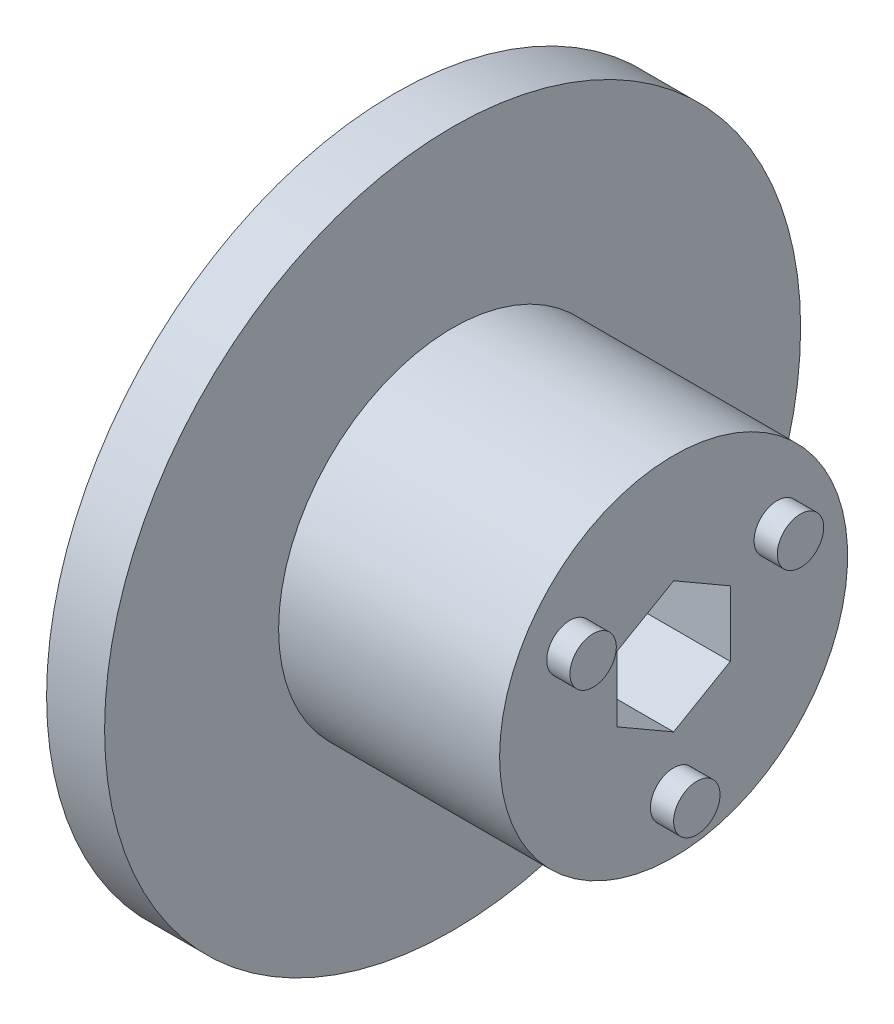
ISO-10303-21;
HEADER;
FILE_DESCRIPTION(('STEP AP214'),'2;1');
FILE_NAME('part.step','',(''),(''),'','','');
FILE_SCHEMA(('AUTOMOTIVE_DESIGN { 1 0 10303 214 1 1 1 1 }'));
ENDSEC;
DATA;
#1=APPLICATION_CONTEXT('core data for automotive mechanical design processes');
#2=APPLICATION_PROTOCOL_DEFINITION('international standard','automotive_design',2000,#1);
#3=PRODUCT_CONTEXT('',#1,'mechanical');
#4=PRODUCT('Part','Part','',(#3));
#5=PRODUCT_RELATED_PRODUCT_CATEGORY('part','',(#4));
#6=PRODUCT_DEFINITION_FORMATION('','',#4);
#7=PRODUCT_DEFINITION_CONTEXT('part definition',#1,'design');
#8=PRODUCT_DEFINITION('design','',#6,#7);
#9=PRODUCT_DEFINITION_SHAPE('','',#8);
#10=(LENGTH_UNIT() NAMED_UNIT(*) SI_UNIT(.MILLI.,.METRE.));
#11=(NAMED_UNIT(*) PLANE_ANGLE_UNIT() SI_UNIT($,.RADIAN.));
#12=(NAMED_UNIT(*) SI_UNIT($,.STERADIAN.) SOLID_ANGLE_UNIT());
#13=UNCERTAINTY_MEASURE_WITH_UNIT(LENGTH_MEASURE(1.E-05),#10,'distance_accuracy_value','');
#14=(GEOMETRIC_REPRESENTATION_CONTEXT(3) GLOBAL_UNCERTAINTY_ASSIGNED_CONTEXT((#13)) GLOBAL_UNIT_ASSIGNED_CONTEXT((#10,
#11,#12)) REPRESENTATION_CONTEXT('',''));
#15=CARTESIAN_POINT('',(0.,0.,0.));
#16=DIRECTION('',(0.,0.,1.));
#17=DIRECTION('',(1.,0.,0.));
#18=AXIS2_PLACEMENT_3D('',#15,#16,#17);
#19=CARTESIAN_POINT('',(5.,0.,0.));
#20=DIRECTION('',(-1.,0.,0.));
#21=DIRECTION('',(0.,0.,1.));
#22=AXIS2_PLACEMENT_3D('',#19,#20,#21);
#23=CYLINDRICAL_SURFACE('',#22,30.);
#24=CARTESIAN_POINT('',(5.,0.,0.));
#25=DIRECTION('',(1.,0.,0.));
#26=DIRECTION('',(0.,0.,-1.));
#27=AXIS2_PLACEMENT_3D('',#24,#25,#26);
#28=CIRCLE('',#27,30.);
#29=CARTESIAN_POINT('',(5.,0.,-30.));
#30=VERTEX_POINT('',#29);
#31=EDGE_CURVE('E48',#30,#30,#28,.T.);
#32=ORIENTED_EDGE('',*,*,#31,.F.);
#33=EDGE_LOOP('',(#32));
#34=FACE_BOUND('',#33,.T.);
#35=CARTESIAN_POINT('',(0.,0.,0.));
#36=DIRECTION('',(1.,0.,0.));
#37=DIRECTION('',(0.,0.,-1.));
#38=AXIS2_PLACEMENT_3D('',#35,#36,#37);
#39=CIRCLE('',#38,30.);
#40=CARTESIAN_POINT('',(0.,0.,-30.));
#41=VERTEX_POINT('',#40);
#42=EDGE_CURVE('E42',#41,#41,#39,.T.);
#43=ORIENTED_EDGE('',*,*,#42,.T.);
#44=EDGE_LOOP('',(#43));
#45=FACE_BOUND('',#44,.T.);
#46=ADVANCED_FACE('F39',(#34,#45),#23,.T.);
#47=CARTESIAN_POINT('',(5.,0.,0.));
#48=DIRECTION('',(1.,0.,0.));
#49=DIRECTION('',(0.,0.,-1.));
#50=AXIS2_PLACEMENT_3D('',#47,#48,#49);
#51=PLANE('',#50);
#52=CARTESIAN_POINT('',(5.,0.,0.));
#53=DIRECTION('',(1.,0.,0.));
#54=DIRECTION('',(0.,0.,-1.));
#55=AXIS2_PLACEMENT_3D('',#52,#53,#54);
#56=CIRCLE('',#55,15.);
#57=CARTESIAN_POINT('',(5.,0.,15.));
#58=VERTEX_POINT('',#57);
#59=EDGE_CURVE('E11',#58,#58,#56,.T.);
#60=ORIENTED_EDGE('',*,*,#59,.F.);
#61=EDGE_LOOP('',(#60));
#62=FACE_BOUND('',#61,.T.);
#63=ORIENTED_EDGE('',*,*,#31,.T.);
#64=EDGE_LOOP('',(#63));
#65=FACE_BOUND('',#64,.T.);
#66=ADVANCED_FACE('F163',(#62,#65),#51,.T.);
#67=CARTESIAN_POINT('',(0.,0.,0.));
#68=DIRECTION('',(1.,0.,0.));
#69=DIRECTION('',(0.,0.,-1.));
#70=AXIS2_PLACEMENT_3D('',#67,#68,#69);
#71=PLANE('',#70);
#72=DIRECTION('',(0.,-1.,0.));
#73=VECTOR('',#72,1.);
#74=CARTESIAN_POINT('',(0.,-2.82035606499132,-4.885));
#75=LINE('',#74,#73);
#76=CARTESIAN_POINT('',(0.,2.82035606499132,-4.885));
#77=VERTEX_POINT('',#76);
#78=CARTESIAN_POINT('',(0.,-2.82035606499132,-4.885));
#79=VERTEX_POINT('',#78);
#80=EDGE_CURVE('E354',#77,#79,#75,.T.);
#81=ORIENTED_EDGE('',*,*,#80,.F.);
#82=DIRECTION('',(0.,-0.5,-0.866025403784439));
#83=VECTOR('',#82,1.);
#84=CARTESIAN_POINT('',(0.,2.82035606499132,-4.885));
#85=LINE('',#84,#83);
#86=CARTESIAN_POINT('',(0.,5.64071212998265,0.));
#87=VERTEX_POINT('',#86);
#88=EDGE_CURVE('E148',#87,#77,#85,.T.);
#89=ORIENTED_EDGE('',*,*,#88,.F.);
#90=DIRECTION('',(0.,0.5,-0.866025403784439));
#91=VECTOR('',#90,1.);
#92=CARTESIAN_POINT('',(0.,5.64071212998265,0.));
#93=LINE('',#92,#91);
#94=CARTESIAN_POINT('',(0.,2.82035606499132,4.885));
#95=VERTEX_POINT('',#94);
#96=EDGE_CURVE('E144',#95,#87,#93,.T.);
#97=ORIENTED_EDGE('',*,*,#96,.F.);
#98=DIRECTION('',(0.,1.,0.));
#99=VECTOR('',#98,1.);
#100=CARTESIAN_POINT('',(0.,2.82035606499132,4.885));
#101=LINE('',#100,#99);
#102=CARTESIAN_POINT('',(0.,-2.82035606499132,4.885));
#103=VERTEX_POINT('',#102);
#104=EDGE_CURVE('E100',#103,#95,#101,.T.);
#105=ORIENTED_EDGE('',*,*,#104,.F.);
#106=DIRECTION('',(0.,0.5,0.866025403784439));
#107=VECTOR('',#106,1.);
#108=CARTESIAN_POINT('',(0.,-2.82035606499132,4.885));
#109=LINE('',#108,#107);
#110=CARTESIAN_POINT('',(0.,-5.64071212998265,0.));
#111=VERTEX_POINT('',#110);
#112=EDGE_CURVE('E348',#111,#103,#109,.T.);
#113=ORIENTED_EDGE('',*,*,#112,.F.);
#114=DIRECTION('',(0.,-0.5,0.866025403784439));
#115=VECTOR('',#114,1.);
#116=CARTESIAN_POINT('',(0.,-5.64071212998265,0.));
#117=LINE('',#116,#115);
#118=EDGE_CURVE('E351',#79,#111,#117,.T.);
#119=ORIENTED_EDGE('',*,*,#118,.F.);
#120=EDGE_LOOP('',(#81,#89,#97,#105,#113,#119));
#121=FACE_BOUND('',#120,.T.);
#122=ORIENTED_EDGE('',*,*,#42,.F.);
#123=EDGE_LOOP('',(#122));
#124=FACE_BOUND('',#123,.T.);
#125=ADVANCED_FACE('F160',(#121,#124),#71,.F.);
#126=CARTESIAN_POINT('',(24.05,0.,0.));
#127=DIRECTION('',(-1.,0.,0.));
#128=DIRECTION('',(0.,0.,1.));
#129=AXIS2_PLACEMENT_3D('',#126,#127,#128);
#130=CYLINDRICAL_SURFACE('',#129,15.);
#131=CARTESIAN_POINT('',(24.05,0.,0.));
#132=DIRECTION('',(1.,0.,0.));
#133=DIRECTION('',(0.,0.,-1.));
#134=AXIS2_PLACEMENT_3D('',#131,#132,#133);
#135=CIRCLE('',#134,15.);
#136=CARTESIAN_POINT('',(24.05,0.,15.));
#137=VERTEX_POINT('',#136);
#138=EDGE_CURVE('E147',#137,#137,#135,.T.);
#139=CARTESIAN_POINT('',(24.05,0.,15.));
#140=CARTESIAN_POINT('',(23.8515625,0.,15.));
#141=CARTESIAN_POINT('',(23.653125,0.,15.));
#142=CARTESIAN_POINT('',(23.25625,0.,15.));
#143=CARTESIAN_POINT('',(23.0578125,0.,15.));
#144=CARTESIAN_POINT('',(22.6609375,0.,15.));
#145=CARTESIAN_POINT('',(22.4625,0.,15.));
#146=CARTESIAN_POINT('',(22.065625,0.,15.));
#147=CARTESIAN_POINT('',(21.8671875,0.,15.));
#148=CARTESIAN_POINT('',(21.4703125,0.,15.));
#149=CARTESIAN_POINT('',(21.271875,0.,15.));
#150=CARTESIAN_POINT('',(20.875,0.,15.));
#151=CARTESIAN_POINT('',(20.6765625,0.,15.));
#152=CARTESIAN_POINT('',(20.2796875,0.,15.));
#153=CARTESIAN_POINT('',(20.08125,0.,15.));
#154=CARTESIAN_POINT('',(19.684375,0.,15.));
#155=CARTESIAN_POINT('',(19.4859375,0.,15.));
#156=CARTESIAN_POINT('',(19.0890625,0.,15.));
#157=CARTESIAN_POINT('',(18.890625,0.,15.));
#158=CARTESIAN_POINT('',(18.49375,0.,15.));
#159=CARTESIAN_POINT('',(18.2953125,0.,15.));
#160=CARTESIAN_POINT('',(17.8984375,0.,15.));
#161=CARTESIAN_POINT('',(17.7,0.,15.));
#162=CARTESIAN_POINT('',(17.303125,0.,15.));
#163=CARTESIAN_POINT('',(17.1046875,0.,15.));
#164=CARTESIAN_POINT('',(16.7078125,0.,15.));
#165=CARTESIAN_POINT('',(16.509375,0.,15.));
#166=CARTESIAN_POINT('',(16.1125,0.,15.));
#167=CARTESIAN_POINT('',(15.9140625,0.,15.));
#168=CARTESIAN_POINT('',(15.5171875,0.,15.));
#169=CARTESIAN_POINT('',(15.31875,0.,15.));
#170=CARTESIAN_POINT('',(14.921875,0.,15.));
#171=CARTESIAN_POINT('',(14.7234375,0.,15.));
#172=CARTESIAN_POINT('',(14.3265625,0.,15.));
#173=CARTESIAN_POINT('',(14.128125,0.,15.));
#174=CARTESIAN_POINT('',(13.73125,0.,15.));
#175=CARTESIAN_POINT('',(13.5328125,0.,15.));
#176=CARTESIAN_POINT('',(13.1359375,0.,15.));
#177=CARTESIAN_POINT('',(12.9375,0.,15.));
#178=CARTESIAN_POINT('',(12.540625,0.,15.));
#179=CARTESIAN_POINT('',(12.3421875,0.,15.));
#180=CARTESIAN_POINT('',(11.9453125,0.,15.));
#181=CARTESIAN_POINT('',(11.746875,0.,15.));
#182=CARTESIAN_POINT('',(11.35,0.,15.));
#183=CARTESIAN_POINT('',(11.1515625,0.,15.));
#184=CARTESIAN_POINT('',(10.7546875,0.,15.));
#185=CARTESIAN_POINT('',(10.55625,0.,15.));
#186=CARTESIAN_POINT('',(10.159375,0.,15.));
#187=CARTESIAN_POINT('',(9.9609375,0.,15.));
#188=CARTESIAN_POINT('',(9.5640625,0.,15.));
#189=CARTESIAN_POINT('',(9.365625,0.,15.));
#190=CARTESIAN_POINT('',(8.96875,0.,15.));
#191=CARTESIAN_POINT('',(8.7703125,0.,15.));
#192=CARTESIAN_POINT('',(8.3734375,0.,15.));
#193=CARTESIAN_POINT('',(8.175,0.,15.));
#194=CARTESIAN_POINT('',(7.778125,0.,15.));
#195=CARTESIAN_POINT('',(7.5796875,0.,15.));
#196=CARTESIAN_POINT('',(7.1828125,0.,15.));
#197=CARTESIAN_POINT('',(6.984375,0.,15.));
#198=CARTESIAN_POINT('',(6.5875,0.,15.));
#199=CARTESIAN_POINT('',(6.3890625,0.,15.));
#200=CARTESIAN_POINT('',(5.9921875,0.,15.));
#201=CARTESIAN_POINT('',(5.79375,0.,15.));
#202=CARTESIAN_POINT('',(5.396875,0.,15.));
#203=CARTESIAN_POINT('',(5.1984375,0.,15.));
#204=CARTESIAN_POINT('',(5.,0.,15.));
#205=B_SPLINE_CURVE_WITH_KNOTS('',3,(#139,#140,#141,#142,#143,#144,#145,#146,#147,#148,#149,
#150,#151,#152,#153,#154,#155,#156,#157,#158,#159,#160,#161,#162,#163,#164,#165,#166,#167,#168,
#169,#170,#171,#172,#173,#174,#175,#176,#177,#178,#179,#180,#181,#182,#183,#184,#185,#186,#187,
#188,#189,#190,#191,#192,#193,#194,#195,#196,#197,#198,#199,#200,#201,#202,#203,#204),
.UNSPECIFIED.,.F.,.F.,(4,2,2,2,2,2,2,2,2,2,2,2,2,2,2,2,2,2,2,2,2,2,2,2,2,2,2,2,2,2,2,2,4),(0.,
0.5953125,1.190625,1.7859375,2.38125,2.9765625,3.571875,4.1671875,4.7625,5.3578125,5.953125,
6.5484375,7.14375,7.7390625,8.334375,8.9296875,9.525,10.1203125,10.715625,11.3109375,11.90625,
12.5015625,13.096875,13.6921875,14.2875,14.8828125,15.478125,16.0734375,16.66875,17.2640625,
17.859375,18.4546875,19.05),.UNSPECIFIED.);
#206=EDGE_CURVE('BSEAM162',#137,#58,#205,.T.);
#207=ORIENTED_EDGE('',*,*,#138,.F.);
#208=ORIENTED_EDGE('',*,*,#59,.T.);
#209=ORIENTED_EDGE('',*,*,#206,.T.);
#210=ORIENTED_EDGE('',*,*,#206,.F.);
#211=EDGE_LOOP('',(#207,#209,#208,#210));
#212=FACE_BOUND('',#211,.T.);
#213=ADVANCED_FACE('F162',(#212),#130,.T.);
#214=CARTESIAN_POINT('',(24.05,0.,0.));
#215=DIRECTION('',(1.,0.,0.));
#216=DIRECTION('',(0.,0.,-1.));
#217=AXIS2_PLACEMENT_3D('',#214,#215,#216);
#218=PLANE('',#217);
#219=CARTESIAN_POINT('',(24.05,5.16017803249566,8.93769052838329));
#220=DIRECTION('',(1.,0.,0.));
#221=DIRECTION('',(0.,0.,-1.));
#222=AXIS2_PLACEMENT_3D('',#219,#220,#221);
#223=CIRCLE('',#222,2.);
#224=CARTESIAN_POINT('',(24.05,5.16017803249566,6.93769052838329));
#225=VERTEX_POINT('',#224);
#226=EDGE_CURVE('E325',#225,#225,#223,.T.);
#227=ORIENTED_EDGE('',*,*,#226,.F.);
#228=EDGE_LOOP('',(#227));
#229=FACE_BOUND('',#228,.T.);
#230=CARTESIAN_POINT('',(24.05,5.16017803249567,-8.93769052838329));
#231=DIRECTION('',(1.,0.,0.));
#232=DIRECTION('',(0.,0.,-1.));
#233=AXIS2_PLACEMENT_3D('',#230,#231,#232);
#234=CIRCLE('',#233,2.);
#235=CARTESIAN_POINT('',(24.05,5.16017803249567,-10.9376905283833));
#236=VERTEX_POINT('',#235);
#237=EDGE_CURVE('E324',#236,#236,#234,.T.);
#238=ORIENTED_EDGE('',*,*,#237,.F.);
#239=EDGE_LOOP('',(#238));
#240=FACE_BOUND('',#239,.T.);
#241=CARTESIAN_POINT('',(24.05,-10.3203560649913,0.));
#242=DIRECTION('',(1.,0.,0.));
#243=DIRECTION('',(0.,0.,-1.));
#244=AXIS2_PLACEMENT_3D('',#241,#242,#243);
#245=CIRCLE('',#244,2.);
#246=CARTESIAN_POINT('',(24.05,-10.3203560649913,-2.));
#247=VERTEX_POINT('',#246);
#248=EDGE_CURVE('E337',#247,#247,#245,.T.);
#249=ORIENTED_EDGE('',*,*,#248,.F.);
#250=EDGE_LOOP('',(#249));
#251=FACE_BOUND('',#250,.T.);
#252=DIRECTION('',(0.,0.5,0.866025403784439));
#253=VECTOR('',#252,1.);
#254=CARTESIAN_POINT('',(24.05,2.82035606499132,-4.885));
#255=LINE('',#254,#253);
#256=CARTESIAN_POINT('',(24.05,2.82035606499132,-4.885));
#257=VERTEX_POINT('',#256);
#258=CARTESIAN_POINT('',(24.05,5.64071212998265,0.));
#259=VERTEX_POINT('',#258);
#260=EDGE_CURVE('E64',#257,#259,#255,.T.);
#261=ORIENTED_EDGE('',*,*,#260,.F.);
#262=DIRECTION('',(0.,1.,0.));
#263=VECTOR('',#262,1.);
#264=CARTESIAN_POINT('',(24.05,-2.82035606499132,-4.885));
#265=LINE('',#264,#263);
#266=CARTESIAN_POINT('',(24.05,-2.82035606499132,-4.885));
#267=VERTEX_POINT('',#266);
#268=EDGE_CURVE('E127',#267,#257,#265,.T.);
#269=ORIENTED_EDGE('',*,*,#268,.F.);
#270=DIRECTION('',(0.,0.5,-0.866025403784439));
#271=VECTOR('',#270,1.);
#272=CARTESIAN_POINT('',(24.05,-5.64071212998265,0.));
#273=LINE('',#272,#271);
#274=CARTESIAN_POINT('',(24.05,-5.64071212998265,0.));
#275=VERTEX_POINT('',#274);
#276=EDGE_CURVE('E120',#275,#267,#273,.T.);
#277=ORIENTED_EDGE('',*,*,#276,.F.);
#278=DIRECTION('',(0.,-0.5,-0.866025403784439));
#279=VECTOR('',#278,1.);
#280=CARTESIAN_POINT('',(24.05,-2.82035606499132,4.885));
#281=LINE('',#280,#279);
#282=CARTESIAN_POINT('',(24.05,-2.82035606499132,4.885));
#283=VERTEX_POINT('',#282);
#284=EDGE_CURVE('E116',#283,#275,#281,.T.);
#285=ORIENTED_EDGE('',*,*,#284,.F.);
#286=DIRECTION('',(0.,-1.,0.));
#287=VECTOR('',#286,1.);
#288=CARTESIAN_POINT('',(24.05,2.82035606499132,4.885));
#289=LINE('',#288,#287);
#290=CARTESIAN_POINT('',(24.05,2.82035606499132,4.885));
#291=VERTEX_POINT('',#290);
#292=EDGE_CURVE('E97',#291,#283,#289,.T.);
#293=ORIENTED_EDGE('',*,*,#292,.F.);
#294=DIRECTION('',(0.,-0.5,0.866025403784439));
#295=VECTOR('',#294,1.);
#296=CARTESIAN_POINT('',(24.05,5.64071212998265,0.));
#297=LINE('',#296,#295);
#298=EDGE_CURVE('E107',#259,#291,#297,.T.);
#299=ORIENTED_EDGE('',*,*,#298,.F.);
#300=EDGE_LOOP('',(#261,#269,#277,#285,#293,#299));
#301=FACE_BOUND('',#300,.T.);
#302=ORIENTED_EDGE('',*,*,#138,.T.);
#303=EDGE_LOOP('',(#302));
#304=FACE_BOUND('',#303,.T.);
#305=ADVANCED_FACE('F112',(#229,#240,#251,#301,#304),#218,.T.);
#306=CARTESIAN_POINT('',(-14.9239215132395,2.82035606499132,-4.885));
#307=DIRECTION('',(0.,0.866025403784439,-0.5));
#308=DIRECTION('',(0.,0.5,0.866025403784439));
#309=AXIS2_PLACEMENT_3D('',#306,#307,#308);
#310=PLANE('',#309);
#311=ORIENTED_EDGE('',*,*,#88,.T.);
#312=DIRECTION('',(1.,0.,0.));
#313=VECTOR('',#312,1.);
#314=CARTESIAN_POINT('',(-14.9239215132395,2.82035606499132,-4.885));
#315=LINE('',#314,#313);
#316=EDGE_CURVE('E131',#77,#257,#315,.T.);
#317=ORIENTED_EDGE('',*,*,#316,.T.);
#318=ORIENTED_EDGE('',*,*,#260,.T.);
#319=DIRECTION('',(1.,0.,0.));
#320=VECTOR('',#319,1.);
#321=CARTESIAN_POINT('',(-14.9239215132395,5.64071212998265,0.));
#322=LINE('',#321,#320);
#323=EDGE_CURVE('E104',#87,#259,#322,.T.);
#324=ORIENTED_EDGE('',*,*,#323,.F.);
#325=EDGE_LOOP('',(#311,#317,#318,#324));
#326=FACE_BOUND('',#325,.T.);
#327=ADVANCED_FACE('F199',(#326),#310,.F.);
#328=CARTESIAN_POINT('',(-14.9239215132395,-2.82035606499132,-4.885));
#329=DIRECTION('',(0.,0.,-1.));
#330=DIRECTION('',(-1.,0.,0.));
#331=AXIS2_PLACEMENT_3D('',#328,#329,#330);
#332=PLANE('',#331);
#333=ORIENTED_EDGE('',*,*,#80,.T.);
#334=DIRECTION('',(1.,0.,0.));
#335=VECTOR('',#334,1.);
#336=CARTESIAN_POINT('',(-14.9239215132395,-2.82035606499132,-4.885));
#337=LINE('',#336,#335);
#338=EDGE_CURVE('E134',#79,#267,#337,.T.);
#339=ORIENTED_EDGE('',*,*,#338,.T.);
#340=ORIENTED_EDGE('',*,*,#268,.T.);
#341=ORIENTED_EDGE('',*,*,#316,.F.);
#342=EDGE_LOOP('',(#333,#339,#340,#341));
#343=FACE_BOUND('',#342,.T.);
#344=ADVANCED_FACE('F204',(#343),#332,.F.);
#345=CARTESIAN_POINT('',(-14.9239215132395,-5.64071212998265,0.));
#346=DIRECTION('',(0.,-0.866025403784438,-0.5));
#347=DIRECTION('',(0.,0.5,-0.866025403784439));
#348=AXIS2_PLACEMENT_3D('',#345,#346,#347);
#349=PLANE('',#348);
#350=ORIENTED_EDGE('',*,*,#118,.T.);
#351=DIRECTION('',(1.,0.,0.));
#352=VECTOR('',#351,1.);
#353=CARTESIAN_POINT('',(-14.9239215132395,-5.64071212998265,0.));
#354=LINE('',#353,#352);
#355=EDGE_CURVE('E137',#111,#275,#354,.T.);
#356=ORIENTED_EDGE('',*,*,#355,.T.);
#357=ORIENTED_EDGE('',*,*,#276,.T.);
#358=ORIENTED_EDGE('',*,*,#338,.F.);
#359=EDGE_LOOP('',(#350,#356,#357,#358));
#360=FACE_BOUND('',#359,.T.);
#361=ADVANCED_FACE('F213',(#360),#349,.F.);
#362=CARTESIAN_POINT('',(-14.9239215132395,-2.82035606499132,4.885));
#363=DIRECTION('',(0.,-0.866025403784438,0.5));
#364=DIRECTION('',(0.,-0.5,-0.866025403784439));
#365=AXIS2_PLACEMENT_3D('',#362,#363,#364);
#366=PLANE('',#365);
#367=ORIENTED_EDGE('',*,*,#112,.T.);
#368=DIRECTION('',(1.,0.,0.));
#369=VECTOR('',#368,1.);
#370=CARTESIAN_POINT('',(-14.9239215132395,-2.82035606499132,4.885));
#371=LINE('',#370,#369);
#372=EDGE_CURVE('E103',#103,#283,#371,.T.);
#373=ORIENTED_EDGE('',*,*,#372,.T.);
#374=ORIENTED_EDGE('',*,*,#284,.T.);
#375=ORIENTED_EDGE('',*,*,#355,.F.);
#376=EDGE_LOOP('',(#367,#373,#374,#375));
#377=FACE_BOUND('',#376,.T.);
#378=ADVANCED_FACE('F223',(#377),#366,.F.);
#379=CARTESIAN_POINT('',(-14.9239215132395,2.82035606499132,4.885));
#380=DIRECTION('',(0.,0.,1.));
#381=DIRECTION('',(0.,-1.,0.));
#382=AXIS2_PLACEMENT_3D('',#379,#380,#381);
#383=PLANE('',#382);
#384=ORIENTED_EDGE('',*,*,#104,.T.);
#385=DIRECTION('',(1.,0.,0.));
#386=VECTOR('',#385,1.);
#387=CARTESIAN_POINT('',(-14.9239215132395,2.82035606499132,4.885));
#388=LINE('',#387,#386);
#389=EDGE_CURVE('E56',#95,#291,#388,.T.);
#390=ORIENTED_EDGE('',*,*,#389,.T.);
#391=ORIENTED_EDGE('',*,*,#292,.T.);
#392=ORIENTED_EDGE('',*,*,#372,.F.);
#393=EDGE_LOOP('',(#384,#390,#391,#392));
#394=FACE_BOUND('',#393,.T.);
#395=ADVANCED_FACE('F94',(#394),#383,.F.);
#396=CARTESIAN_POINT('',(-14.9239215132395,5.64071212998265,0.));
#397=DIRECTION('',(0.,0.866025403784439,0.5));
#398=DIRECTION('',(0.,-0.5,0.866025403784439));
#399=AXIS2_PLACEMENT_3D('',#396,#397,#398);
#400=PLANE('',#399);
#401=ORIENTED_EDGE('',*,*,#96,.T.);
#402=ORIENTED_EDGE('',*,*,#323,.T.);
#403=ORIENTED_EDGE('',*,*,#298,.T.);
#404=ORIENTED_EDGE('',*,*,#389,.F.);
#405=EDGE_LOOP('',(#401,#402,#403,#404));
#406=FACE_BOUND('',#405,.T.);
#407=ADVANCED_FACE('F108',(#406),#400,.F.);
#408=CARTESIAN_POINT('',(26.05,-10.3203560649913,0.));
#409=DIRECTION('',(-1.,0.,0.));
#410=DIRECTION('',(0.,0.,1.));
#411=AXIS2_PLACEMENT_3D('',#408,#409,#410);
#412=CYLINDRICAL_SURFACE('',#411,2.);
#413=CARTESIAN_POINT('',(26.05,-10.3203560649913,0.));
#414=DIRECTION('',(1.,0.,0.));
#415=DIRECTION('',(0.,0.,-1.));
#416=AXIS2_PLACEMENT_3D('',#413,#414,#415);
#417=CIRCLE('',#416,2.);
#418=CARTESIAN_POINT('',(26.05,-10.3203560649913,-2.));
#419=VERTEX_POINT('',#418);
#420=EDGE_CURVE('E339',#419,#419,#417,.T.);
#421=ORIENTED_EDGE('',*,*,#420,.F.);
#422=EDGE_LOOP('',(#421));
#423=FACE_BOUND('',#422,.T.);
#424=ORIENTED_EDGE('',*,*,#248,.T.);
#425=EDGE_LOOP('',(#424));
#426=FACE_BOUND('',#425,.T.);
#427=ADVANCED_FACE('F250',(#423,#426),#412,.T.);
#428=CARTESIAN_POINT('',(26.05,-10.3203560649913,0.));
#429=DIRECTION('',(1.,0.,0.));
#430=DIRECTION('',(0.,0.,-1.));
#431=AXIS2_PLACEMENT_3D('',#428,#429,#430);
#432=PLANE('',#431);
#433=ORIENTED_EDGE('',*,*,#420,.T.);
#434=EDGE_LOOP('',(#433));
#435=FACE_BOUND('',#434,.T.);
#436=ADVANCED_FACE('F266',(#435),#432,.T.);
#437=CARTESIAN_POINT('',(26.05,5.16017803249567,-8.93769052838329));
#438=DIRECTION('',(-1.,0.,0.));
#439=DIRECTION('',(0.,0.,1.));
#440=AXIS2_PLACEMENT_3D('',#437,#438,#439);
#441=CYLINDRICAL_SURFACE('',#440,2.);
#442=CARTESIAN_POINT('',(26.05,5.16017803249567,-8.93769052838329));
#443=DIRECTION('',(1.,0.,0.));
#444=DIRECTION('',(0.,0.,-1.));
#445=AXIS2_PLACEMENT_3D('',#442,#443,#444);
#446=CIRCLE('',#445,2.);
#447=CARTESIAN_POINT('',(26.05,5.16017803249567,-10.9376905283833));
#448=VERTEX_POINT('',#447);
#449=EDGE_CURVE('E330',#448,#448,#446,.T.);
#450=ORIENTED_EDGE('',*,*,#449,.F.);
#451=EDGE_LOOP('',(#450));
#452=FACE_BOUND('',#451,.T.);
#453=ORIENTED_EDGE('',*,*,#237,.T.);
#454=EDGE_LOOP('',(#453));
#455=FACE_BOUND('',#454,.T.);
#456=ADVANCED_FACE('F276',(#452,#455),#441,.T.);
#457=CARTESIAN_POINT('',(26.05,5.16017803249567,-8.93769052838329));
#458=DIRECTION('',(1.,0.,0.));
#459=DIRECTION('',(0.,0.,-1.));
#460=AXIS2_PLACEMENT_3D('',#457,#458,#459);
#461=PLANE('',#460);
#462=ORIENTED_EDGE('',*,*,#449,.T.);
#463=EDGE_LOOP('',(#462));
#464=FACE_BOUND('',#463,.T.);
#465=ADVANCED_FACE('F286',(#464),#461,.T.);
#466=CARTESIAN_POINT('',(26.05,5.16017803249566,8.93769052838329));
#467=DIRECTION('',(-1.,0.,0.));
#468=DIRECTION('',(0.,0.,1.));
#469=AXIS2_PLACEMENT_3D('',#466,#467,#468);
#470=CYLINDRICAL_SURFACE('',#469,2.);
#471=CARTESIAN_POINT('',(26.05,5.16017803249566,8.93769052838329));
#472=DIRECTION('',(1.,0.,0.));
#473=DIRECTION('',(0.,0.,-1.));
#474=AXIS2_PLACEMENT_3D('',#471,#472,#473);
#475=CIRCLE('',#474,2.);
#476=CARTESIAN_POINT('',(26.05,5.16017803249566,6.93769052838329));
#477=VERTEX_POINT('',#476);
#478=EDGE_CURVE('E322',#477,#477,#475,.T.);
#479=ORIENTED_EDGE('',*,*,#478,.F.);
#480=EDGE_LOOP('',(#479));
#481=FACE_BOUND('',#480,.T.);
#482=ORIENTED_EDGE('',*,*,#226,.T.);
#483=EDGE_LOOP('',(#482));
#484=FACE_BOUND('',#483,.T.);
#485=ADVANCED_FACE('F296',(#481,#484),#470,.T.);
#486=CARTESIAN_POINT('',(26.05,5.16017803249566,8.93769052838329));
#487=DIRECTION('',(1.,0.,0.));
#488=DIRECTION('',(0.,0.,-1.));
#489=AXIS2_PLACEMENT_3D('',#486,#487,#488);
#490=PLANE('',#489);
#491=ORIENTED_EDGE('',*,*,#478,.T.);
#492=EDGE_LOOP('',(#491));
#493=FACE_BOUND('',#492,.T.);
#494=ADVANCED_FACE('F306',(#493),#490,.T.);
#495=CLOSED_SHELL('',(#46,#66,#125,#213,#305,#327,#344,#361,#378,#395,#407,#427,#436,#456,#465,
#485,#494));
#496=MANIFOLD_SOLID_BREP('B2',#495);
#497=ADVANCED_BREP_SHAPE_REPRESENTATION('',(#18,#496),#14);
#498=SHAPE_DEFINITION_REPRESENTATION(#9,#497);
ENDSEC;
END-ISO-10303-21;
